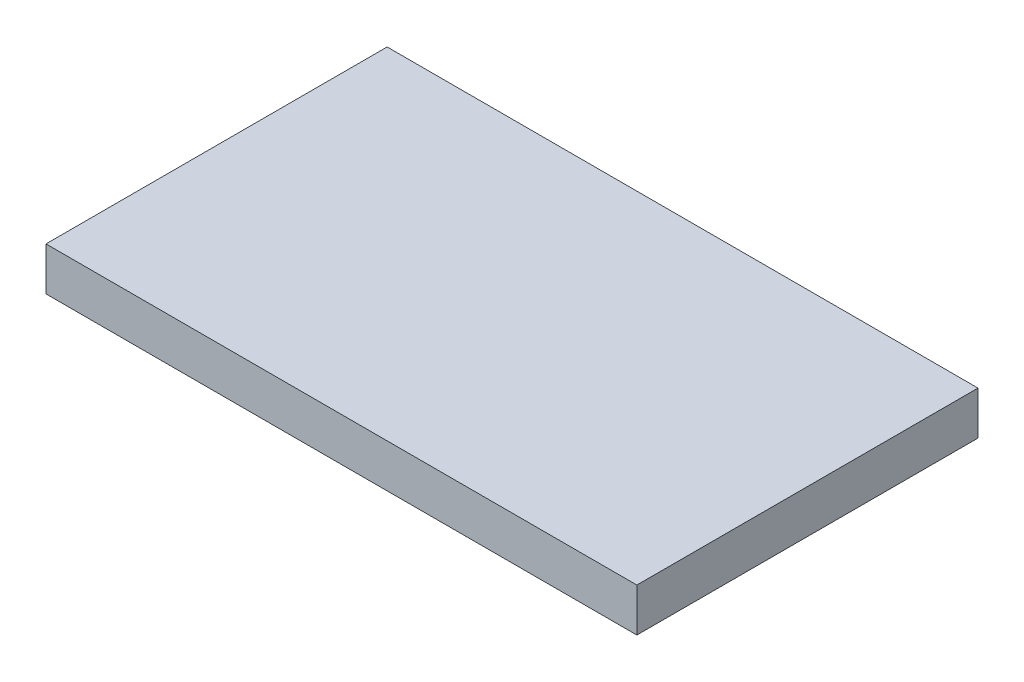
ISO-10303-21;
HEADER;
FILE_DESCRIPTION(('STEP AP214'),'2;1');
FILE_NAME('part.step','',(''),(''),'','','');
FILE_SCHEMA(('AUTOMOTIVE_DESIGN { 1 0 10303 214 1 1 1 1 }'));
ENDSEC;
DATA;
#1=APPLICATION_CONTEXT('core data for automotive mechanical design processes');
#2=APPLICATION_PROTOCOL_DEFINITION('international standard','automotive_design',2000,#1);
#3=PRODUCT_CONTEXT('',#1,'mechanical');
#4=PRODUCT('Part','Part','',(#3));
#5=PRODUCT_RELATED_PRODUCT_CATEGORY('part','',(#4));
#6=PRODUCT_DEFINITION_FORMATION('','',#4);
#7=PRODUCT_DEFINITION_CONTEXT('part definition',#1,'design');
#8=PRODUCT_DEFINITION('design','',#6,#7);
#9=PRODUCT_DEFINITION_SHAPE('','',#8);
#10=(LENGTH_UNIT() NAMED_UNIT(*) SI_UNIT(.MILLI.,.METRE.));
#11=(NAMED_UNIT(*) PLANE_ANGLE_UNIT() SI_UNIT($,.RADIAN.));
#12=(NAMED_UNIT(*) SI_UNIT($,.STERADIAN.) SOLID_ANGLE_UNIT());
#13=UNCERTAINTY_MEASURE_WITH_UNIT(LENGTH_MEASURE(1.E-05),#10,'distance_accuracy_value','');
#14=(GEOMETRIC_REPRESENTATION_CONTEXT(3) GLOBAL_UNCERTAINTY_ASSIGNED_CONTEXT((#13)) GLOBAL_UNIT_ASSIGNED_CONTEXT((#10,
#11,#12)) REPRESENTATION_CONTEXT('',''));
#15=CARTESIAN_POINT('',(0.,0.,0.));
#16=DIRECTION('',(0.,0.,1.));
#17=DIRECTION('',(1.,0.,0.));
#18=AXIS2_PLACEMENT_3D('',#15,#16,#17);
#19=CARTESIAN_POINT('',(-43.3012701892221,6.35,-25.));
#20=DIRECTION('',(1.,0.,0.));
#21=DIRECTION('',(0.,0.,-1.));
#22=AXIS2_PLACEMENT_3D('',#19,#20,#21);
#23=PLANE('',#22);
#24=DIRECTION('',(0.,0.,1.));
#25=VECTOR('',#24,1.);
#26=CARTESIAN_POINT('',(-43.3012701892221,0.,-25.));
#27=LINE('',#26,#25);
#28=CARTESIAN_POINT('',(-43.3012701892221,0.,-25.));
#29=VERTEX_POINT('',#28);
#30=CARTESIAN_POINT('',(-43.3012701892221,0.,25.));
#31=VERTEX_POINT('',#30);
#32=EDGE_CURVE('E99',#29,#31,#27,.T.);
#33=ORIENTED_EDGE('',*,*,#32,.T.);
#34=DIRECTION('',(0.,-1.,0.));
#35=VECTOR('',#34,1.);
#36=CARTESIAN_POINT('',(-43.3012701892221,6.35,25.));
#37=LINE('',#36,#35);
#38=CARTESIAN_POINT('',(-43.3012701892221,6.35,25.));
#39=VERTEX_POINT('',#38);
#40=EDGE_CURVE('E11',#39,#31,#37,.T.);
#41=ORIENTED_EDGE('',*,*,#40,.F.);
#42=DIRECTION('',(0.,0.,1.));
#43=VECTOR('',#42,1.);
#44=CARTESIAN_POINT('',(-43.3012701892221,6.35,-25.));
#45=LINE('',#44,#43);
#46=CARTESIAN_POINT('',(-43.3012701892221,6.35,-25.));
#47=VERTEX_POINT('',#46);
#48=EDGE_CURVE('E87',#47,#39,#45,.T.);
#49=ORIENTED_EDGE('',*,*,#48,.F.);
#50=DIRECTION('',(0.,-1.,0.));
#51=VECTOR('',#50,1.);
#52=CARTESIAN_POINT('',(-43.3012701892221,6.35,-25.));
#53=LINE('',#52,#51);
#54=EDGE_CURVE('E95',#47,#29,#53,.T.);
#55=ORIENTED_EDGE('',*,*,#54,.T.);
#56=EDGE_LOOP('',(#33,#41,#49,#55));
#57=FACE_BOUND('',#56,.T.);
#58=ADVANCED_FACE('F36',(#57),#23,.F.);
#59=CARTESIAN_POINT('',(-43.3012701892221,6.35,25.));
#60=DIRECTION('',(0.,0.,-1.));
#61=DIRECTION('',(-1.,0.,0.));
#62=AXIS2_PLACEMENT_3D('',#59,#60,#61);
#63=PLANE('',#62);
#64=DIRECTION('',(1.,0.,0.));
#65=VECTOR('',#64,1.);
#66=CARTESIAN_POINT('',(-43.3012701892221,0.,25.));
#67=LINE('',#66,#65);
#68=CARTESIAN_POINT('',(43.3012701892221,0.,25.));
#69=VERTEX_POINT('',#68);
#70=EDGE_CURVE('E91',#31,#69,#67,.T.);
#71=ORIENTED_EDGE('',*,*,#70,.T.);
#72=DIRECTION('',(0.,-1.,0.));
#73=VECTOR('',#72,1.);
#74=CARTESIAN_POINT('',(43.3012701892221,6.35,25.));
#75=LINE('',#74,#73);
#76=CARTESIAN_POINT('',(43.3012701892221,6.35,25.));
#77=VERTEX_POINT('',#76);
#78=EDGE_CURVE('E44',#77,#69,#75,.T.);
#79=ORIENTED_EDGE('',*,*,#78,.F.);
#80=DIRECTION('',(1.,0.,0.));
#81=VECTOR('',#80,1.);
#82=CARTESIAN_POINT('',(-43.3012701892221,6.35,25.));
#83=LINE('',#82,#81);
#84=EDGE_CURVE('E82',#39,#77,#83,.T.);
#85=ORIENTED_EDGE('',*,*,#84,.F.);
#86=ORIENTED_EDGE('',*,*,#40,.T.);
#87=EDGE_LOOP('',(#71,#79,#85,#86));
#88=FACE_BOUND('',#87,.T.);
#89=ADVANCED_FACE('F90',(#88),#63,.F.);
#90=CARTESIAN_POINT('',(43.3012701892221,6.35,-25.));
#91=DIRECTION('',(-1.,0.,0.));
#92=DIRECTION('',(0.,0.,1.));
#93=AXIS2_PLACEMENT_3D('',#90,#91,#92);
#94=PLANE('',#93);
#95=DIRECTION('',(0.,0.,-1.));
#96=VECTOR('',#95,1.);
#97=CARTESIAN_POINT('',(43.3012701892221,0.,-25.));
#98=LINE('',#97,#96);
#99=CARTESIAN_POINT('',(43.3012701892221,0.,-25.));
#100=VERTEX_POINT('',#99);
#101=EDGE_CURVE('E69',#69,#100,#98,.T.);
#102=ORIENTED_EDGE('',*,*,#101,.T.);
#103=DIRECTION('',(0.,-1.,0.));
#104=VECTOR('',#103,1.);
#105=CARTESIAN_POINT('',(43.3012701892221,6.35,-25.));
#106=LINE('',#105,#104);
#107=CARTESIAN_POINT('',(43.3012701892221,6.35,-25.));
#108=VERTEX_POINT('',#107);
#109=EDGE_CURVE('E92',#108,#100,#106,.T.);
#110=ORIENTED_EDGE('',*,*,#109,.F.);
#111=DIRECTION('',(0.,0.,-1.));
#112=VECTOR('',#111,1.);
#113=CARTESIAN_POINT('',(43.3012701892221,6.35,-25.));
#114=LINE('',#113,#112);
#115=EDGE_CURVE('E85',#77,#108,#114,.T.);
#116=ORIENTED_EDGE('',*,*,#115,.F.);
#117=ORIENTED_EDGE('',*,*,#78,.T.);
#118=EDGE_LOOP('',(#102,#110,#116,#117));
#119=FACE_BOUND('',#118,.T.);
#120=ADVANCED_FACE('F93',(#119),#94,.F.);
#121=CARTESIAN_POINT('',(-43.3012701892221,6.35,-25.));
#122=DIRECTION('',(0.,0.,1.));
#123=DIRECTION('',(1.,0.,0.));
#124=AXIS2_PLACEMENT_3D('',#121,#122,#123);
#125=PLANE('',#124);
#126=DIRECTION('',(-1.,0.,0.));
#127=VECTOR('',#126,1.);
#128=CARTESIAN_POINT('',(-43.3012701892221,0.,-25.));
#129=LINE('',#128,#127);
#130=EDGE_CURVE('E75',#100,#29,#129,.T.);
#131=ORIENTED_EDGE('',*,*,#130,.T.);
#132=ORIENTED_EDGE('',*,*,#54,.F.);
#133=DIRECTION('',(-1.,0.,0.));
#134=VECTOR('',#133,1.);
#135=CARTESIAN_POINT('',(-43.3012701892221,6.35,-25.));
#136=LINE('',#135,#134);
#137=EDGE_CURVE('E52',#108,#47,#136,.T.);
#138=ORIENTED_EDGE('',*,*,#137,.F.);
#139=ORIENTED_EDGE('',*,*,#109,.T.);
#140=EDGE_LOOP('',(#131,#132,#138,#139));
#141=FACE_BOUND('',#140,.T.);
#142=ADVANCED_FACE('F106',(#141),#125,.F.);
#143=CARTESIAN_POINT('',(0.,6.35,0.));
#144=DIRECTION('',(0.,1.,0.));
#145=DIRECTION('',(0.,0.,1.));
#146=AXIS2_PLACEMENT_3D('',#143,#144,#145);
#147=PLANE('',#146);
#148=ORIENTED_EDGE('',*,*,#48,.T.);
#149=ORIENTED_EDGE('',*,*,#84,.T.);
#150=ORIENTED_EDGE('',*,*,#115,.T.);
#151=ORIENTED_EDGE('',*,*,#137,.T.);
#152=EDGE_LOOP('',(#148,#149,#150,#151));
#153=FACE_BOUND('',#152,.T.);
#154=ADVANCED_FACE('F83',(#153),#147,.T.);
#155=CARTESIAN_POINT('',(0.,0.,0.));
#156=DIRECTION('',(0.,1.,0.));
#157=DIRECTION('',(0.,0.,1.));
#158=AXIS2_PLACEMENT_3D('',#155,#156,#157);
#159=PLANE('',#158);
#160=ORIENTED_EDGE('',*,*,#32,.F.);
#161=ORIENTED_EDGE('',*,*,#130,.F.);
#162=ORIENTED_EDGE('',*,*,#101,.F.);
#163=ORIENTED_EDGE('',*,*,#70,.F.);
#164=EDGE_LOOP('',(#160,#161,#162,#163));
#165=FACE_BOUND('',#164,.T.);
#166=ADVANCED_FACE('F109',(#165),#159,.F.);
#167=CLOSED_SHELL('',(#58,#89,#120,#142,#154,#166));
#168=MANIFOLD_SOLID_BREP('B2',#167);
#169=ADVANCED_BREP_SHAPE_REPRESENTATION('',(#18,#168),#14);
#170=SHAPE_DEFINITION_REPRESENTATION(#9,#169);
ENDSEC;
END-ISO-10303-21;
